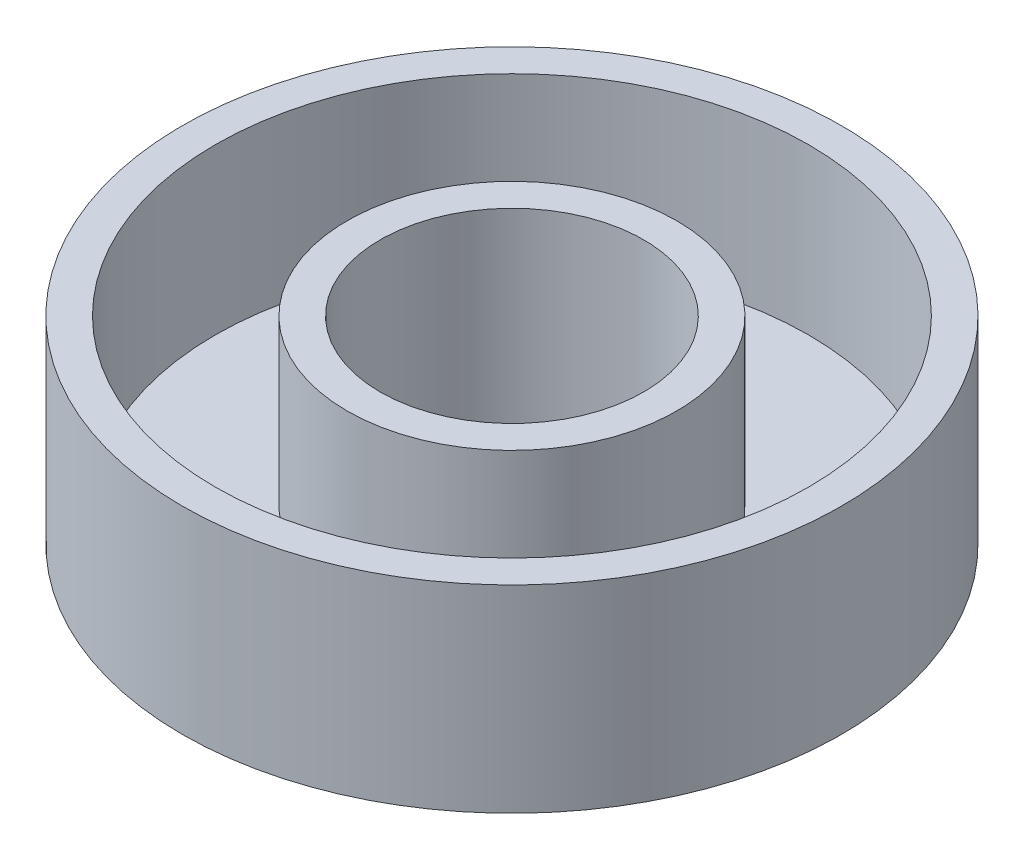
ISO-10303-21;
HEADER;
FILE_DESCRIPTION(('STEP AP214'),'2;1');
FILE_NAME('part.step','',(''),(''),'','','');
FILE_SCHEMA(('AUTOMOTIVE_DESIGN { 1 0 10303 214 1 1 1 1 }'));
ENDSEC;
DATA;
#1=APPLICATION_CONTEXT('core data for automotive mechanical design processes');
#2=APPLICATION_PROTOCOL_DEFINITION('international standard','automotive_design',2000,#1);
#3=PRODUCT_CONTEXT('',#1,'mechanical');
#4=PRODUCT('Part','Part','',(#3));
#5=PRODUCT_RELATED_PRODUCT_CATEGORY('part','',(#4));
#6=PRODUCT_DEFINITION_FORMATION('','',#4);
#7=PRODUCT_DEFINITION_CONTEXT('part definition',#1,'design');
#8=PRODUCT_DEFINITION('design','',#6,#7);
#9=PRODUCT_DEFINITION_SHAPE('','',#8);
#10=(LENGTH_UNIT() NAMED_UNIT(*) SI_UNIT(.MILLI.,.METRE.));
#11=(NAMED_UNIT(*) PLANE_ANGLE_UNIT() SI_UNIT($,.RADIAN.));
#12=(NAMED_UNIT(*) SI_UNIT($,.STERADIAN.) SOLID_ANGLE_UNIT());
#13=UNCERTAINTY_MEASURE_WITH_UNIT(LENGTH_MEASURE(1.E-05),#10,'distance_accuracy_value','');
#14=(GEOMETRIC_REPRESENTATION_CONTEXT(3) GLOBAL_UNCERTAINTY_ASSIGNED_CONTEXT((#13)) GLOBAL_UNIT_ASSIGNED_CONTEXT((#10,
#11,#12)) REPRESENTATION_CONTEXT('',''));
#15=CARTESIAN_POINT('',(0.,0.,0.));
#16=DIRECTION('',(0.,0.,1.));
#17=DIRECTION('',(1.,0.,0.));
#18=AXIS2_PLACEMENT_3D('',#15,#16,#17);
#19=CARTESIAN_POINT('',(0.,6.,0.));
#20=DIRECTION('',(0.,1.,0.));
#21=DIRECTION('',(0.,0.,1.));
#22=AXIS2_PLACEMENT_3D('',#19,#20,#21);
#23=PLANE('',#22);
#24=CARTESIAN_POINT('',(0.,6.,0.));
#25=DIRECTION('',(0.,1.,0.));
#26=DIRECTION('',(0.,0.,1.));
#27=AXIS2_PLACEMENT_3D('',#24,#25,#26);
#28=CIRCLE('',#27,4.);
#29=CARTESIAN_POINT('',(0.,6.,4.));
#30=VERTEX_POINT('',#29);
#31=EDGE_CURVE('E45',#30,#30,#28,.T.);
#32=ORIENTED_EDGE('',*,*,#31,.F.);
#33=EDGE_LOOP('',(#32));
#34=FACE_BOUND('',#33,.T.);
#35=CARTESIAN_POINT('',(0.,6.,0.));
#36=DIRECTION('',(0.,1.,0.));
#37=DIRECTION('',(0.,0.,1.));
#38=AXIS2_PLACEMENT_3D('',#35,#36,#37);
#39=CIRCLE('',#38,5.);
#40=CARTESIAN_POINT('',(0.,6.,5.));
#41=VERTEX_POINT('',#40);
#42=EDGE_CURVE('E55',#41,#41,#39,.T.);
#43=ORIENTED_EDGE('',*,*,#42,.T.);
#44=EDGE_LOOP('',(#43));
#45=FACE_BOUND('',#44,.T.);
#46=ADVANCED_FACE('F31',(#34,#45),#23,.T.);
#47=CARTESIAN_POINT('',(0.,6.,0.));
#48=DIRECTION('',(0.,-1.,0.));
#49=DIRECTION('',(0.,0.,-1.));
#50=AXIS2_PLACEMENT_3D('',#47,#48,#49);
#51=CYLINDRICAL_SURFACE('',#50,10.);
#52=CARTESIAN_POINT('',(0.,6.,0.));
#53=DIRECTION('',(0.,1.,0.));
#54=DIRECTION('',(0.,0.,1.));
#55=AXIS2_PLACEMENT_3D('',#52,#53,#54);
#56=CIRCLE('',#55,10.);
#57=CARTESIAN_POINT('',(0.,6.,10.));
#58=VERTEX_POINT('',#57);
#59=EDGE_CURVE('E10',#58,#58,#56,.T.);
#60=ORIENTED_EDGE('',*,*,#59,.F.);
#61=EDGE_LOOP('',(#60));
#62=FACE_BOUND('',#61,.T.);
#63=CARTESIAN_POINT('',(0.,0.,0.));
#64=DIRECTION('',(0.,1.,0.));
#65=DIRECTION('',(0.,0.,1.));
#66=AXIS2_PLACEMENT_3D('',#63,#64,#65);
#67=CIRCLE('',#66,10.);
#68=CARTESIAN_POINT('',(0.,0.,10.));
#69=VERTEX_POINT('',#68);
#70=EDGE_CURVE('E39',#69,#69,#67,.T.);
#71=ORIENTED_EDGE('',*,*,#70,.T.);
#72=EDGE_LOOP('',(#71));
#73=FACE_BOUND('',#72,.T.);
#74=ADVANCED_FACE('F33',(#62,#73),#51,.T.);
#75=CARTESIAN_POINT('',(0.,6.,0.));
#76=DIRECTION('',(0.,1.,0.));
#77=DIRECTION('',(0.,0.,1.));
#78=AXIS2_PLACEMENT_3D('',#75,#76,#77);
#79=CIRCLE('',#78,9.);
#80=CARTESIAN_POINT('',(0.,6.,9.));
#81=VERTEX_POINT('',#80);
#82=EDGE_CURVE('E49',#81,#81,#79,.T.);
#83=ORIENTED_EDGE('',*,*,#82,.F.);
#84=EDGE_LOOP('',(#83));
#85=FACE_BOUND('',#84,.T.);
#86=ORIENTED_EDGE('',*,*,#59,.T.);
#87=EDGE_LOOP('',(#86));
#88=FACE_BOUND('',#87,.T.);
#89=ADVANCED_FACE('F77',(#85,#88),#23,.T.);
#90=CARTESIAN_POINT('',(0.,0.,0.));
#91=DIRECTION('',(0.,1.,0.));
#92=DIRECTION('',(0.,0.,1.));
#93=AXIS2_PLACEMENT_3D('',#90,#91,#92);
#94=PLANE('',#93);
#95=CARTESIAN_POINT('',(0.,0.,0.));
#96=DIRECTION('',(0.,1.,0.));
#97=DIRECTION('',(0.,0.,1.));
#98=AXIS2_PLACEMENT_3D('',#95,#96,#97);
#99=CIRCLE('',#98,4.);
#100=CARTESIAN_POINT('',(0.,0.,4.));
#101=VERTEX_POINT('',#100);
#102=EDGE_CURVE('E35',#101,#101,#99,.T.);
#103=ORIENTED_EDGE('',*,*,#102,.T.);
#104=EDGE_LOOP('',(#103));
#105=FACE_BOUND('',#104,.T.);
#106=ORIENTED_EDGE('',*,*,#70,.F.);
#107=EDGE_LOOP('',(#106));
#108=FACE_BOUND('',#107,.T.);
#109=ADVANCED_FACE('F79',(#105,#108),#94,.F.);
#110=CARTESIAN_POINT('',(0.,-14.,0.));
#111=DIRECTION('',(0.,1.,0.));
#112=DIRECTION('',(0.,0.,1.));
#113=AXIS2_PLACEMENT_3D('',#110,#111,#112);
#114=CYLINDRICAL_SURFACE('',#113,4.);
#115=ORIENTED_EDGE('',*,*,#31,.T.);
#116=EDGE_LOOP('',(#115));
#117=FACE_BOUND('',#116,.T.);
#118=ORIENTED_EDGE('',*,*,#102,.F.);
#119=EDGE_LOOP('',(#118));
#120=FACE_BOUND('',#119,.T.);
#121=ADVANCED_FACE('F73',(#117,#120),#114,.F.);
#122=CARTESIAN_POINT('',(0.,1.,0.));
#123=DIRECTION('',(0.,1.,0.));
#124=DIRECTION('',(0.,0.,1.));
#125=AXIS2_PLACEMENT_3D('',#122,#123,#124);
#126=CYLINDRICAL_SURFACE('',#125,9.);
#127=CARTESIAN_POINT('',(0.,1.,0.));
#128=DIRECTION('',(0.,1.,0.));
#129=DIRECTION('',(0.,0.,1.));
#130=AXIS2_PLACEMENT_3D('',#127,#128,#129);
#131=CIRCLE('',#130,9.);
#132=CARTESIAN_POINT('',(0.,1.,9.));
#133=VERTEX_POINT('',#132);
#134=EDGE_CURVE('E48',#133,#133,#131,.T.);
#135=ORIENTED_EDGE('',*,*,#134,.F.);
#136=EDGE_LOOP('',(#135));
#137=FACE_BOUND('',#136,.T.);
#138=ORIENTED_EDGE('',*,*,#82,.T.);
#139=EDGE_LOOP('',(#138));
#140=FACE_BOUND('',#139,.T.);
#141=ADVANCED_FACE('F67',(#137,#140),#126,.F.);
#142=CARTESIAN_POINT('',(0.,1.,0.));
#143=DIRECTION('',(0.,1.,0.));
#144=DIRECTION('',(0.,0.,1.));
#145=AXIS2_PLACEMENT_3D('',#142,#143,#144);
#146=PLANE('',#145);
#147=CARTESIAN_POINT('',(0.,1.,0.));
#148=DIRECTION('',(0.,1.,0.));
#149=DIRECTION('',(0.,0.,1.));
#150=AXIS2_PLACEMENT_3D('',#147,#148,#149);
#151=CIRCLE('',#150,5.);
#152=CARTESIAN_POINT('',(0.,1.,5.));
#153=VERTEX_POINT('',#152);
#154=EDGE_CURVE('E52',#153,#153,#151,.T.);
#155=ORIENTED_EDGE('',*,*,#154,.F.);
#156=EDGE_LOOP('',(#155));
#157=FACE_BOUND('',#156,.T.);
#158=ORIENTED_EDGE('',*,*,#134,.T.);
#159=EDGE_LOOP('',(#158));
#160=FACE_BOUND('',#159,.T.);
#161=ADVANCED_FACE('F64',(#157,#160),#146,.T.);
#162=CARTESIAN_POINT('',(0.,1.,0.));
#163=DIRECTION('',(0.,1.,0.));
#164=DIRECTION('',(0.,0.,1.));
#165=AXIS2_PLACEMENT_3D('',#162,#163,#164);
#166=CYLINDRICAL_SURFACE('',#165,5.);
#167=ORIENTED_EDGE('',*,*,#154,.T.);
#168=EDGE_LOOP('',(#167));
#169=FACE_BOUND('',#168,.T.);
#170=ORIENTED_EDGE('',*,*,#42,.F.);
#171=EDGE_LOOP('',(#170));
#172=FACE_BOUND('',#171,.T.);
#173=ADVANCED_FACE('F61',(#169,#172),#166,.T.);
#174=CLOSED_SHELL('',(#46,#74,#89,#109,#121,#141,#161,#173));
#175=MANIFOLD_SOLID_BREP('B2',#174);
#176=ADVANCED_BREP_SHAPE_REPRESENTATION('',(#18,#175),#14);
#177=SHAPE_DEFINITION_REPRESENTATION(#9,#176);
ENDSEC;
END-ISO-10303-21;
